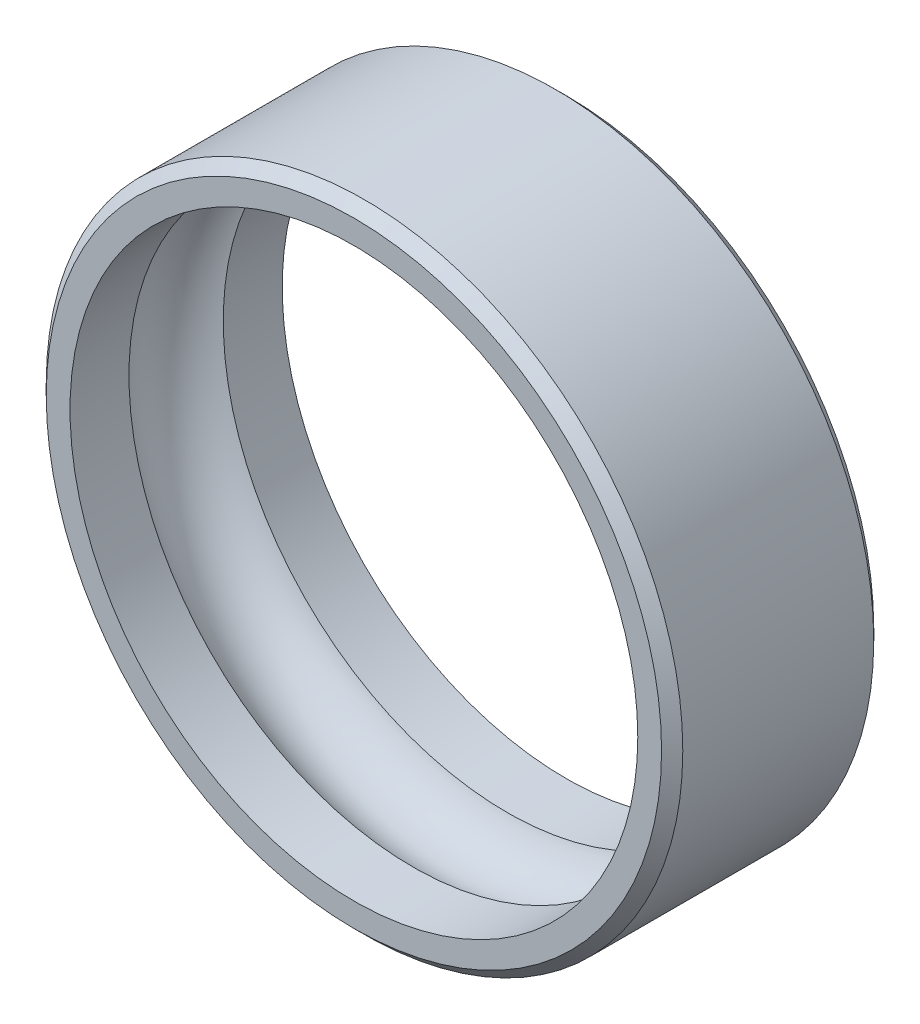
ISO-10303-21;
HEADER;
FILE_DESCRIPTION(('STEP AP214'),'2;1');
FILE_NAME('part.step','',(''),(''),'','','');
FILE_SCHEMA(('AUTOMOTIVE_DESIGN { 1 0 10303 214 1 1 1 1 }'));
ENDSEC;
DATA;
#1=APPLICATION_CONTEXT('core data for automotive mechanical design processes');
#2=APPLICATION_PROTOCOL_DEFINITION('international standard','automotive_design',2000,#1);
#3=PRODUCT_CONTEXT('',#1,'mechanical');
#4=PRODUCT('Part','Part','',(#3));
#5=PRODUCT_RELATED_PRODUCT_CATEGORY('part','',(#4));
#6=PRODUCT_DEFINITION_FORMATION('','',#4);
#7=PRODUCT_DEFINITION_CONTEXT('part definition',#1,'design');
#8=PRODUCT_DEFINITION('design','',#6,#7);
#9=PRODUCT_DEFINITION_SHAPE('','',#8);
#10=(LENGTH_UNIT() NAMED_UNIT(*) SI_UNIT(.MILLI.,.METRE.));
#11=(NAMED_UNIT(*) PLANE_ANGLE_UNIT() SI_UNIT($,.RADIAN.));
#12=(NAMED_UNIT(*) SI_UNIT($,.STERADIAN.) SOLID_ANGLE_UNIT());
#13=UNCERTAINTY_MEASURE_WITH_UNIT(LENGTH_MEASURE(1.E-05),#10,'distance_accuracy_value','');
#14=(GEOMETRIC_REPRESENTATION_CONTEXT(3) GLOBAL_UNCERTAINTY_ASSIGNED_CONTEXT((#13)) GLOBAL_UNIT_ASSIGNED_CONTEXT((#10,
#11,#12)) REPRESENTATION_CONTEXT('',''));
#15=CARTESIAN_POINT('',(0.,0.,0.));
#16=DIRECTION('',(0.,0.,1.));
#17=DIRECTION('',(1.,0.,0.));
#18=AXIS2_PLACEMENT_3D('',#15,#16,#17);
#19=CARTESIAN_POINT('',(0.,0.,0.));
#20=DIRECTION('',(0.,0.,1.));
#21=DIRECTION('',(1.,0.,0.));
#22=AXIS2_PLACEMENT_3D('',#19,#20,#21);
#23=TOROIDAL_SURFACE('',#22,3.96875,0.758760243513404);
#24=CARTESIAN_POINT('',(0.,0.,-0.705555555555556));
#25=DIRECTION('',(0.,0.,1.));
#26=DIRECTION('',(1.,0.,0.));
#27=AXIS2_PLACEMENT_3D('',#24,#25,#26);
#28=CIRCLE('',#27,4.24787087912088);
#29=CARTESIAN_POINT('',(4.24787087912088,0.,-0.705555555555556));
#30=VERTEX_POINT('',#29);
#31=EDGE_CURVE('E33',#30,#30,#28,.F.);
#32=ORIENTED_EDGE('',*,*,#31,.T.);
#33=EDGE_LOOP('',(#32));
#34=FACE_BOUND('',#33,.T.);
#35=CARTESIAN_POINT('',(0.,0.,0.705555555555555));
#36=DIRECTION('',(0.,0.,1.));
#37=DIRECTION('',(1.,0.,0.));
#38=AXIS2_PLACEMENT_3D('',#35,#36,#37);
#39=CIRCLE('',#38,4.24787087912088);
#40=CARTESIAN_POINT('',(4.24787087912088,0.,0.705555555555555));
#41=VERTEX_POINT('',#40);
#42=EDGE_CURVE('E31',#41,#41,#39,.T.);
#43=ORIENTED_EDGE('',*,*,#42,.T.);
#44=EDGE_LOOP('',(#43));
#45=FACE_BOUND('',#44,.T.);
#46=ADVANCED_FACE('F15',(#34,#45),#23,.F.);
#47=CARTESIAN_POINT('',(0.,0.,1.5875));
#48=DIRECTION('',(0.,0.,1.));
#49=DIRECTION('',(1.,0.,0.));
#50=AXIS2_PLACEMENT_3D('',#47,#48,#49);
#51=CYLINDRICAL_SURFACE('',#50,4.24787087912088);
#52=CARTESIAN_POINT('',(0.,0.,-1.5875));
#53=DIRECTION('',(0.,0.,1.));
#54=DIRECTION('',(1.,0.,0.));
#55=AXIS2_PLACEMENT_3D('',#52,#53,#54);
#56=CIRCLE('',#55,4.24787087912088);
#57=CARTESIAN_POINT('',(4.24787087912088,0.,-1.5875));
#58=VERTEX_POINT('',#57);
#59=EDGE_CURVE('E19',#58,#58,#56,.F.);
#60=ORIENTED_EDGE('',*,*,#59,.T.);
#61=EDGE_LOOP('',(#60));
#62=FACE_BOUND('',#61,.T.);
#63=ORIENTED_EDGE('',*,*,#31,.F.);
#64=EDGE_LOOP('',(#63));
#65=FACE_BOUND('',#64,.T.);
#66=ADVANCED_FACE('F49',(#62,#65),#51,.F.);
#67=CARTESIAN_POINT('',(0.,0.,1.5875));
#68=DIRECTION('',(0.,0.,1.));
#69=DIRECTION('',(1.,0.,0.));
#70=AXIS2_PLACEMENT_3D('',#67,#68,#69);
#71=CYLINDRICAL_SURFACE('',#70,4.24787087912088);
#72=ORIENTED_EDGE('',*,*,#42,.F.);
#73=EDGE_LOOP('',(#72));
#74=FACE_BOUND('',#73,.T.);
#75=CARTESIAN_POINT('',(0.,0.,1.5875));
#76=DIRECTION('',(0.,0.,1.));
#77=DIRECTION('',(1.,0.,0.));
#78=AXIS2_PLACEMENT_3D('',#75,#76,#77);
#79=CIRCLE('',#78,4.24787087912088);
#80=CARTESIAN_POINT('',(4.24787087912088,0.,1.5875));
#81=VERTEX_POINT('',#80);
#82=EDGE_CURVE('E42',#81,#81,#79,.T.);
#83=ORIENTED_EDGE('',*,*,#82,.T.);
#84=EDGE_LOOP('',(#83));
#85=FACE_BOUND('',#84,.T.);
#86=ADVANCED_FACE('F56',(#74,#85),#71,.F.);
#87=CARTESIAN_POINT('',(0.,4.60375,-1.5875));
#88=DIRECTION('',(0.,0.,1.));
#89=DIRECTION('',(1.,0.,0.));
#90=AXIS2_PLACEMENT_3D('',#87,#88,#89);
#91=PLANE('',#90);
#92=ORIENTED_EDGE('',*,*,#59,.F.);
#93=EDGE_LOOP('',(#92));
#94=FACE_BOUND('',#93,.T.);
#95=CARTESIAN_POINT('',(0.,0.,-1.58750000008467));
#96=DIRECTION('',(0.,0.,1.));
#97=DIRECTION('',(1.,0.,0.));
#98=AXIS2_PLACEMENT_3D('',#95,#96,#97);
#99=CIRCLE('',#98,4.60375000000113);
#100=CARTESIAN_POINT('',(4.60375000000113,0.,-1.58750000008467));
#101=VERTEX_POINT('',#100);
#102=EDGE_CURVE('E40',#101,#101,#99,.T.);
#103=ORIENTED_EDGE('',*,*,#102,.F.);
#104=EDGE_LOOP('',(#103));
#105=FACE_BOUND('',#104,.T.);
#106=ADVANCED_FACE('F52',(#94,#105),#91,.F.);
#107=CARTESIAN_POINT('',(0.,4.60375,1.5875));
#108=DIRECTION('',(0.,0.,-1.));
#109=DIRECTION('',(-1.,0.,0.));
#110=AXIS2_PLACEMENT_3D('',#107,#108,#109);
#111=PLANE('',#110);
#112=CARTESIAN_POINT('',(0.,0.,1.58750000008467));
#113=DIRECTION('',(0.,0.,-1.));
#114=DIRECTION('',(-1.,0.,0.));
#115=AXIS2_PLACEMENT_3D('',#112,#113,#114);
#116=CIRCLE('',#115,4.60375000000113);
#117=CARTESIAN_POINT('',(-4.60375000000113,0.,1.58750000008467));
#118=VERTEX_POINT('',#117);
#119=EDGE_CURVE('E28',#118,#118,#116,.T.);
#120=ORIENTED_EDGE('',*,*,#119,.F.);
#121=EDGE_LOOP('',(#120));
#122=FACE_BOUND('',#121,.T.);
#123=ORIENTED_EDGE('',*,*,#82,.F.);
#124=EDGE_LOOP('',(#123));
#125=FACE_BOUND('',#124,.T.);
#126=ADVANCED_FACE('F55',(#122,#125),#111,.F.);
#127=CARTESIAN_POINT('',(0.,0.,-1.42875000000231));
#128=DIRECTION('',(0.,0.,1.));
#129=DIRECTION('',(1.,0.,0.));
#130=AXIS2_PLACEMENT_3D('',#127,#128,#129);
#131=CONICAL_SURFACE('',#130,4.76250000002665,0.785398163218414);
#132=CARTESIAN_POINT('',(0.,0.,-1.42875));
#133=DIRECTION('',(0.,0.,1.));
#134=DIRECTION('',(1.,0.,0.));
#135=AXIS2_PLACEMENT_3D('',#132,#133,#134);
#136=CIRCLE('',#135,4.7625);
#137=CARTESIAN_POINT('',(4.7625,0.,-1.42875));
#138=VERTEX_POINT('',#137);
#139=EDGE_CURVE('E23',#138,#138,#136,.T.);
#140=ORIENTED_EDGE('',*,*,#139,.F.);
#141=EDGE_LOOP('',(#140));
#142=FACE_BOUND('',#141,.T.);
#143=ORIENTED_EDGE('',*,*,#102,.T.);
#144=EDGE_LOOP('',(#143));
#145=FACE_BOUND('',#144,.T.);
#146=ADVANCED_FACE('F60',(#142,#145),#131,.T.);
#147=CARTESIAN_POINT('',(0.,0.,1.42875000005915));
#148=DIRECTION('',(0.,0.,-1.));
#149=DIRECTION('',(-1.,0.,0.));
#150=AXIS2_PLACEMENT_3D('',#147,#148,#149);
#151=CONICAL_SURFACE('',#150,4.7624999999698,0.785398163218414);
#152=CARTESIAN_POINT('',(0.,0.,1.42875));
#153=DIRECTION('',(0.,0.,1.));
#154=DIRECTION('',(1.,0.,0.));
#155=AXIS2_PLACEMENT_3D('',#152,#153,#154);
#156=CIRCLE('',#155,4.7625);
#157=CARTESIAN_POINT('',(4.7625,0.,1.42875));
#158=VERTEX_POINT('',#157);
#159=EDGE_CURVE('E10',#158,#158,#156,.F.);
#160=ORIENTED_EDGE('',*,*,#159,.F.);
#161=EDGE_LOOP('',(#160));
#162=FACE_BOUND('',#161,.T.);
#163=ORIENTED_EDGE('',*,*,#119,.T.);
#164=EDGE_LOOP('',(#163));
#165=FACE_BOUND('',#164,.T.);
#166=ADVANCED_FACE('F62',(#162,#165),#151,.T.);
#167=CARTESIAN_POINT('',(0.,0.,1.5875));
#168=DIRECTION('',(0.,0.,1.));
#169=DIRECTION('',(1.,0.,0.));
#170=AXIS2_PLACEMENT_3D('',#167,#168,#169);
#171=CYLINDRICAL_SURFACE('',#170,4.7625);
#172=ORIENTED_EDGE('',*,*,#159,.T.);
#173=EDGE_LOOP('',(#172));
#174=FACE_BOUND('',#173,.T.);
#175=ORIENTED_EDGE('',*,*,#139,.T.);
#176=EDGE_LOOP('',(#175));
#177=FACE_BOUND('',#176,.T.);
#178=ADVANCED_FACE('F70',(#174,#177),#171,.T.);
#179=CLOSED_SHELL('',(#46,#66,#86,#106,#126,#146,#166,#178));
#180=MANIFOLD_SOLID_BREP('B1',#179);
#181=ADVANCED_BREP_SHAPE_REPRESENTATION('',(#18,#180),#14);
#182=SHAPE_DEFINITION_REPRESENTATION(#9,#181);
ENDSEC;
END-ISO-10303-21;
